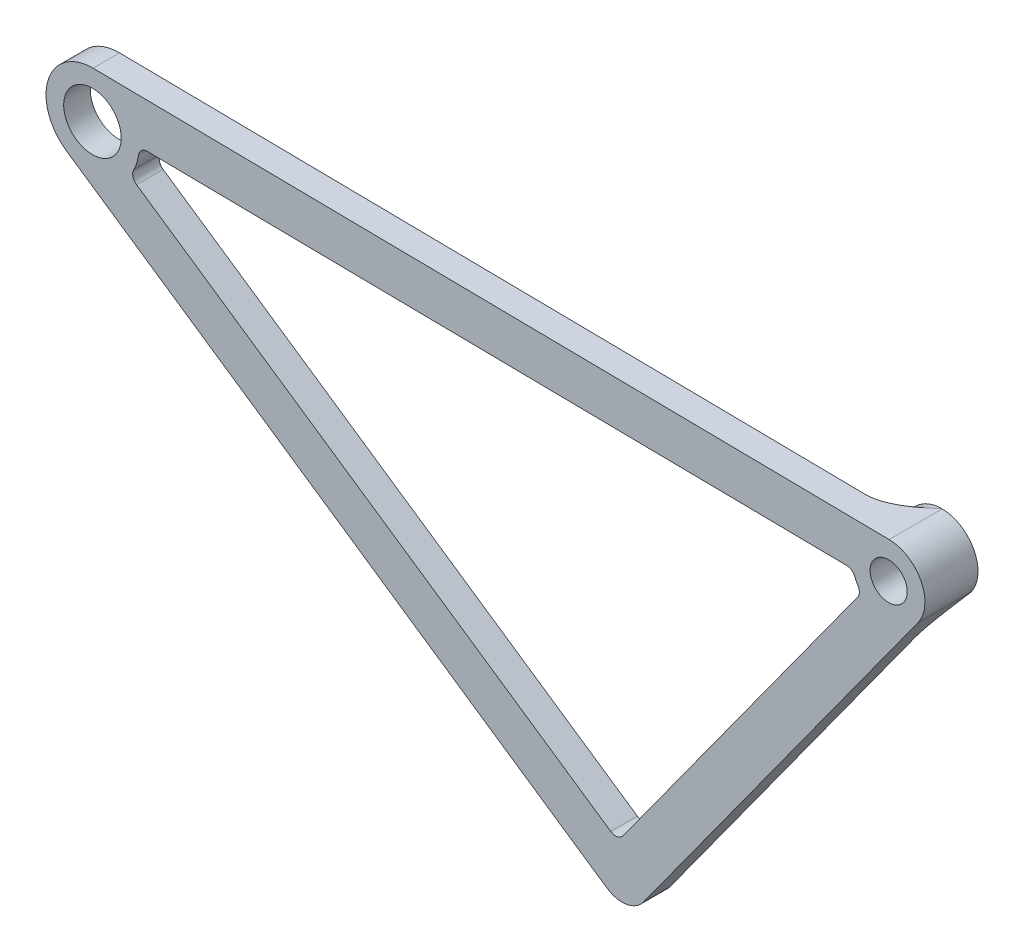
ISO-10303-21;
HEADER;
FILE_DESCRIPTION(('STEP AP214'),'2;1');
FILE_NAME('part.step','',(''),(''),'','','');
FILE_SCHEMA(('AUTOMOTIVE_DESIGN { 1 0 10303 214 1 1 1 1 }'));
ENDSEC;
DATA;
#1=APPLICATION_CONTEXT('core data for automotive mechanical design processes');
#2=APPLICATION_PROTOCOL_DEFINITION('international standard','automotive_design',2000,#1);
#3=PRODUCT_CONTEXT('',#1,'mechanical');
#4=PRODUCT('Part','Part','',(#3));
#5=PRODUCT_RELATED_PRODUCT_CATEGORY('part','',(#4));
#6=PRODUCT_DEFINITION_FORMATION('','',#4);
#7=PRODUCT_DEFINITION_CONTEXT('part definition',#1,'design');
#8=PRODUCT_DEFINITION('design','',#6,#7);
#9=PRODUCT_DEFINITION_SHAPE('','',#8);
#10=(LENGTH_UNIT() NAMED_UNIT(*) SI_UNIT(.MILLI.,.METRE.));
#11=(NAMED_UNIT(*) PLANE_ANGLE_UNIT() SI_UNIT($,.RADIAN.));
#12=(NAMED_UNIT(*) SI_UNIT($,.STERADIAN.) SOLID_ANGLE_UNIT());
#13=UNCERTAINTY_MEASURE_WITH_UNIT(LENGTH_MEASURE(1.E-05),#10,'distance_accuracy_value','');
#14=(GEOMETRIC_REPRESENTATION_CONTEXT(3) GLOBAL_UNCERTAINTY_ASSIGNED_CONTEXT((#13)) GLOBAL_UNIT_ASSIGNED_CONTEXT((#10,
#11,#12)) REPRESENTATION_CONTEXT('',''));
#15=CARTESIAN_POINT('',(0.,0.,0.));
#16=DIRECTION('',(0.,0.,1.));
#17=DIRECTION('',(1.,0.,0.));
#18=AXIS2_PLACEMENT_3D('',#15,#16,#17);
#19=CARTESIAN_POINT('',(90.,0.,1.5));
#20=DIRECTION('',(0.,0.,-1.));
#21=DIRECTION('',(-1.,0.,0.));
#22=AXIS2_PLACEMENT_3D('',#19,#20,#21);
#23=CYLINDRICAL_SURFACE('',#22,4.10000000000001);
#24=CARTESIAN_POINT('',(90.,0.,1.5));
#25=DIRECTION('',(0.,0.,-1.));
#26=DIRECTION('',(-1.,0.,0.));
#27=AXIS2_PLACEMENT_3D('',#24,#25,#26);
#28=CIRCLE('',#27,4.1);
#29=CARTESIAN_POINT('',(86.5314819350052,-2.18617987201531,1.5));
#30=VERTEX_POINT('',#29);
#31=CARTESIAN_POINT('',(86.1759418840921,-1.47870873607982,1.5));
#32=VERTEX_POINT('',#31);
#33=EDGE_CURVE('E379',#30,#32,#28,.T.);
#34=ORIENTED_EDGE('',*,*,#33,.T.);
#35=DIRECTION('',(0.,0.,-1.));
#36=VECTOR('',#35,1.);
#37=CARTESIAN_POINT('',(86.1759418840921,-1.47870873607983,1.5));
#38=LINE('',#37,#36);
#39=CARTESIAN_POINT('',(86.1759418840921,-1.47870873607982,-4.5));
#40=VERTEX_POINT('',#39);
#41=EDGE_CURVE('E395',#32,#40,#38,.T.);
#42=ORIENTED_EDGE('',*,*,#41,.T.);
#43=CARTESIAN_POINT('',(90.,0.,-4.5));
#44=DIRECTION('',(0.,0.,-1.));
#45=DIRECTION('',(-1.,0.,0.));
#46=AXIS2_PLACEMENT_3D('',#43,#44,#45);
#47=CIRCLE('',#46,4.1);
#48=CARTESIAN_POINT('',(86.5314819350052,-2.18617987201531,-4.5));
#49=VERTEX_POINT('',#48);
#50=EDGE_CURVE('E352',#49,#40,#47,.T.);
#51=ORIENTED_EDGE('',*,*,#50,.F.);
#52=DIRECTION('',(0.,0.,-1.));
#53=VECTOR('',#52,1.);
#54=CARTESIAN_POINT('',(86.5314819350052,-2.18617987201531,1.5));
#55=LINE('',#54,#53);
#56=EDGE_CURVE('E393',#49,#30,#55,.F.);
#57=ORIENTED_EDGE('',*,*,#56,.T.);
#58=EDGE_LOOP('',(#34,#42,#51,#57));
#59=FACE_BOUND('',#58,.T.);
#60=ADVANCED_FACE('F41',(#59),#23,.T.);
#61=CARTESIAN_POINT('',(0.,0.,1.5));
#62=DIRECTION('',(0.,0.,1.));
#63=DIRECTION('',(1.,0.,0.));
#64=AXIS2_PLACEMENT_3D('',#61,#62,#63);
#65=PLANE('',#64);
#66=CARTESIAN_POINT('',(0.,0.,1.5));
#67=DIRECTION('',(0.,0.,1.));
#68=DIRECTION('',(1.,0.,0.));
#69=AXIS2_PLACEMENT_3D('',#66,#67,#68);
#70=CIRCLE('',#69,3.25);
#71=CARTESIAN_POINT('',(3.25,0.,1.5));
#72=VERTEX_POINT('',#71);
#73=EDGE_CURVE('E453',#72,#72,#70,.T.);
#74=ORIENTED_EDGE('',*,*,#73,.F.);
#75=EDGE_LOOP('',(#74));
#76=FACE_BOUND('',#75,.T.);
#77=CARTESIAN_POINT('',(0.,0.,1.5));
#78=DIRECTION('',(0.,0.,1.));
#79=DIRECTION('',(1.,0.,0.));
#80=AXIS2_PLACEMENT_3D('',#77,#78,#79);
#81=CIRCLE('',#80,5.25);
#82=CARTESIAN_POINT('',(0.0670833333333359,5.24957139454154,1.5));
#83=VERTEX_POINT('',#82);
#84=CARTESIAN_POINT('',(-2.9553037466832,-4.33920266464246,1.5));
#85=VERTEX_POINT('',#84);
#86=EDGE_CURVE('E191',#83,#85,#81,.T.);
#87=ORIENTED_EDGE('',*,*,#86,.T.);
#88=DIRECTION('',(0.82651479326523,-0.56291499936823,0.));
#89=VECTOR('',#88,1.);
#90=CARTESIAN_POINT('',(-2.9553037466832,-4.33920266464246,1.5));
#91=LINE('',#90,#89);
#92=CARTESIAN_POINT('',(58.1785125856414,-45.9756530494388,1.5));
#93=VERTEX_POINT('',#92);
#94=EDGE_CURVE('E180',#85,#93,#91,.T.);
#95=ORIENTED_EDGE('',*,*,#94,.T.);
#96=CARTESIAN_POINT('',(59.8672575837461,-43.4961086696431,1.5));
#97=DIRECTION('',(0.,0.,1.));
#98=DIRECTION('',(1.,0.,0.));
#99=AXIS2_PLACEMENT_3D('',#96,#97,#98);
#100=CIRCLE('',#99,2.99999999999999);
#101=CARTESIAN_POINT('',(62.2972541343815,-45.2554030633986,1.5));
#102=VERTEX_POINT('',#101);
#103=EDGE_CURVE('E190',#93,#102,#100,.T.);
#104=ORIENTED_EDGE('',*,*,#103,.T.);
#105=DIRECTION('',(0.586431464585179,0.809998850211828,0.));
#106=VECTOR('',#105,1.);
#107=CARTESIAN_POINT('',(62.2972541343815,-45.2554030633986,1.5));
#108=LINE('',#107,#106);
#109=CARTESIAN_POINT('',(93.3209952858685,-2.40436900479924,1.5));
#110=VERTEX_POINT('',#109);
#111=EDGE_CURVE('E459',#102,#110,#108,.T.);
#112=ORIENTED_EDGE('',*,*,#111,.T.);
#113=CARTESIAN_POINT('',(90.,0.,1.5));
#114=DIRECTION('',(0.,0.,1.));
#115=DIRECTION('',(1.,0.,0.));
#116=AXIS2_PLACEMENT_3D('',#113,#114,#115);
#117=CIRCLE('',#116,4.10000000000001);
#118=CARTESIAN_POINT('',(90.0523888888889,4.09966527954674,1.5));
#119=VERTEX_POINT('',#118);
#120=EDGE_CURVE('E337',#110,#119,#117,.T.);
#121=ORIENTED_EDGE('',*,*,#120,.T.);
#122=DIRECTION('',(-0.999918360865057,0.0127777777777776,0.));
#123=VECTOR('',#122,1.);
#124=CARTESIAN_POINT('',(90.0523888888889,4.09966527954675,1.5));
#125=LINE('',#124,#123);
#126=EDGE_CURVE('E197',#119,#83,#125,.T.);
#127=ORIENTED_EDGE('',*,*,#126,.T.);
#128=EDGE_LOOP('',(#87,#95,#104,#112,#121,#127));
#129=FACE_BOUND('',#128,.T.);
#130=CARTESIAN_POINT('',(90.,0.,1.5));
#131=DIRECTION('',(0.,0.,1.));
#132=DIRECTION('',(1.,0.,0.));
#133=AXIS2_PLACEMENT_3D('',#130,#131,#132);
#134=CIRCLE('',#133,2.09999999999999);
#135=CARTESIAN_POINT('',(92.1,0.,1.5));
#136=VERTEX_POINT('',#135);
#137=EDGE_CURVE('E378',#136,#136,#134,.T.);
#138=ORIENTED_EDGE('',*,*,#137,.F.);
#139=EDGE_LOOP('',(#138));
#140=FACE_BOUND('',#139,.T.);
#141=DIRECTION('',(0.82651479326523,-0.56291499936823,0.));
#142=VECTOR('',#141,1.);
#143=CARTESIAN_POINT('',(59.3868925835546,-40.7491467492038,1.5));
#144=LINE('',#143,#142);
#145=CARTESIAN_POINT('',(4.98766067416049,-3.69942441461274,1.5));
#146=VERTEX_POINT('',#145);
#147=CARTESIAN_POINT('',(58.5837950840906,-40.2021805822494,1.5));
#148=VERTEX_POINT('',#147);
#149=EDGE_CURVE('E411',#146,#148,#144,.T.);
#150=ORIENTED_EDGE('',*,*,#149,.F.);
#151=CARTESIAN_POINT('',(5.55057567352873,-2.87290962134751,1.5));
#152=DIRECTION('',(0.,0.,1.));
#153=DIRECTION('',(1.,0.,0.));
#154=AXIS2_PLACEMENT_3D('',#151,#152,#153);
#155=CIRCLE('',#154,1.);
#156=CARTESIAN_POINT('',(4.66248356576413,-2.41324408193191,1.5));
#157=VERTEX_POINT('',#156);
#158=EDGE_CURVE('E400',#146,#157,#155,.F.);
#159=ORIENTED_EDGE('',*,*,#158,.T.);
#160=CARTESIAN_POINT('',(0.,0.,1.5));
#161=DIRECTION('',(0.,0.,-1.));
#162=DIRECTION('',(1.,0.,0.));
#163=AXIS2_PLACEMENT_3D('',#160,#161,#162);
#164=CIRCLE('',#163,5.25);
#165=CARTESIAN_POINT('',(5.20358742300718,-0.696547149245138,1.5));
#166=VERTEX_POINT('',#165);
#167=EDGE_CURVE('E421',#166,#157,#164,.T.);
#168=ORIENTED_EDGE('',*,*,#167,.F.);
#169=CARTESIAN_POINT('',(6.1947469321514,-0.829222796720403,1.5));
#170=DIRECTION('',(0.,0.,1.));
#171=DIRECTION('',(1.,0.,0.));
#172=AXIS2_PLACEMENT_3D('',#169,#170,#171);
#173=CIRCLE('',#172,1.);
#174=CARTESIAN_POINT('',(6.20752470992918,0.170695564144654,1.5));
#175=VERTEX_POINT('',#174);
#176=EDGE_CURVE('E382',#166,#175,#173,.F.);
#177=ORIENTED_EDGE('',*,*,#176,.T.);
#178=DIRECTION('',(-0.999918360865057,0.0127777777777778,0.));
#179=VECTOR('',#178,1.);
#180=CARTESIAN_POINT('',(85.9888265565398,-0.848815413667441,1.5));
#181=LINE('',#180,#179);
#182=CARTESIAN_POINT('',(85.2560225604289,-0.839451042551311,1.5));
#183=VERTEX_POINT('',#182);
#184=EDGE_CURVE('E370',#183,#175,#181,.T.);
#185=ORIENTED_EDGE('',*,*,#184,.F.);
#186=CARTESIAN_POINT('',(85.2432447826511,-1.83936940341637,1.5));
#187=DIRECTION('',(0.,0.,1.));
#188=DIRECTION('',(1.,0.,0.));
#189=AXIS2_PLACEMENT_3D('',#186,#187,#188);
#190=CIRCLE('',#189,1.);
#191=EDGE_CURVE('E66',#183,#32,#190,.F.);
#192=ORIENTED_EDGE('',*,*,#191,.T.);
#193=ORIENTED_EDGE('',*,*,#33,.F.);
#194=CARTESIAN_POINT('',(85.6855019191528,-2.71939447494588,1.5));
#195=DIRECTION('',(0.,0.,1.));
#196=DIRECTION('',(1.,0.,0.));
#197=AXIS2_PLACEMENT_3D('',#194,#195,#196);
#198=CIRCLE('',#197,1.);
#199=CARTESIAN_POINT('',(86.4955007693646,-3.30582593953106,1.5));
#200=VERTEX_POINT('',#199);
#201=EDGE_CURVE('E11',#30,#200,#198,.F.);
#202=ORIENTED_EDGE('',*,*,#201,.T.);
#203=DIRECTION('',(0.586431464585178,0.809998850211828,0.));
#204=VECTOR('',#203,1.);
#205=CARTESIAN_POINT('',(86.9252751764686,-2.71220708272065,1.5));
#206=LINE('',#205,#204);
#207=CARTESIAN_POINT('',(59.9567089336707,-39.9620972535694,1.5));
#208=VERTEX_POINT('',#207);
#209=EDGE_CURVE('E414',#208,#200,#206,.T.);
#210=ORIENTED_EDGE('',*,*,#209,.F.);
#211=CARTESIAN_POINT('',(59.1467100834588,-39.3756657889842,1.5));
#212=DIRECTION('',(0.,0.,1.));
#213=DIRECTION('',(1.,0.,0.));
#214=AXIS2_PLACEMENT_3D('',#211,#212,#213);
#215=CIRCLE('',#214,1.);
#216=EDGE_CURVE('E300',#208,#148,#215,.F.);
#217=ORIENTED_EDGE('',*,*,#216,.T.);
#218=EDGE_LOOP('',(#150,#159,#168,#177,#185,#192,#193,#202,#210,#217));
#219=FACE_BOUND('',#218,.T.);
#220=ADVANCED_FACE('F194',(#76,#129,#140,#219),#65,.T.);
#221=CARTESIAN_POINT('',(0.,0.,-1.5));
#222=DIRECTION('',(0.,0.,1.));
#223=DIRECTION('',(1.,0.,0.));
#224=AXIS2_PLACEMENT_3D('',#221,#222,#223);
#225=PLANE('',#224);
#226=DIRECTION('',(0.82651479326523,-0.56291499936823,0.));
#227=VECTOR('',#226,1.);
#228=CARTESIAN_POINT('',(59.3868925835546,-40.7491467492038,-1.5));
#229=LINE('',#228,#227);
#230=CARTESIAN_POINT('',(4.98766067416049,-3.69942441461274,-1.5));
#231=VERTEX_POINT('',#230);
#232=CARTESIAN_POINT('',(58.5837950840906,-40.2021805822494,-1.5));
#233=VERTEX_POINT('',#232);
#234=EDGE_CURVE('E445',#231,#233,#229,.T.);
#235=ORIENTED_EDGE('',*,*,#234,.T.);
#236=CARTESIAN_POINT('',(59.1467100834588,-39.3756657889842,-1.5));
#237=DIRECTION('',(0.,0.,1.));
#238=DIRECTION('',(1.,0.,0.));
#239=AXIS2_PLACEMENT_3D('',#236,#237,#238);
#240=CIRCLE('',#239,1.);
#241=CARTESIAN_POINT('',(59.9567089336707,-39.9620972535694,-1.5));
#242=VERTEX_POINT('',#241);
#243=EDGE_CURVE('E403',#233,#242,#240,.T.);
#244=ORIENTED_EDGE('',*,*,#243,.T.);
#245=DIRECTION('',(0.586431464585178,0.809998850211828,0.));
#246=VECTOR('',#245,1.);
#247=CARTESIAN_POINT('',(86.9252751764686,-2.71220708272065,-1.5));
#248=LINE('',#247,#246);
#249=CARTESIAN_POINT('',(85.1409244752631,-5.17681224740696,-1.5));
#250=VERTEX_POINT('',#249);
#251=EDGE_CURVE('E447',#242,#250,#248,.T.);
#252=ORIENTED_EDGE('',*,*,#251,.T.);
#253=CARTESIAN_POINT('',(90.,0.,-1.5));
#254=DIRECTION('',(0.,0.,1.));
#255=DIRECTION('',(1.,0.,0.));
#256=AXIS2_PLACEMENT_3D('',#253,#254,#255);
#257=CIRCLE('',#256,7.10000000000001);
#258=CARTESIAN_POINT('',(89.9217155702191,-7.09956840575918,-1.5));
#259=VERTEX_POINT('',#258);
#260=EDGE_CURVE('E208',#250,#259,#257,.T.);
#261=ORIENTED_EDGE('',*,*,#260,.T.);
#262=DIRECTION('',(0.586431464585179,0.809998850211828,0.));
#263=VECTOR('',#262,1.);
#264=CARTESIAN_POINT('',(62.2972541343815,-45.2554030633986,-1.5));
#265=LINE('',#264,#263);
#266=CARTESIAN_POINT('',(62.2972541343815,-45.2554030633986,-1.5));
#267=VERTEX_POINT('',#266);
#268=EDGE_CURVE('E345',#267,#259,#265,.T.);
#269=ORIENTED_EDGE('',*,*,#268,.F.);
#270=CARTESIAN_POINT('',(59.8672575837461,-43.4961086696431,-1.5));
#271=DIRECTION('',(0.,0.,1.));
#272=DIRECTION('',(1.,0.,0.));
#273=AXIS2_PLACEMENT_3D('',#270,#271,#272);
#274=CIRCLE('',#273,2.99999999999999);
#275=CARTESIAN_POINT('',(58.1785125856414,-45.9756530494388,-1.5));
#276=VERTEX_POINT('',#275);
#277=EDGE_CURVE('E467',#276,#267,#274,.T.);
#278=ORIENTED_EDGE('',*,*,#277,.F.);
#279=DIRECTION('',(0.82651479326523,-0.56291499936823,0.));
#280=VECTOR('',#279,1.);
#281=CARTESIAN_POINT('',(-2.9553037466832,-4.33920266464246,-1.5));
#282=LINE('',#281,#280);
#283=CARTESIAN_POINT('',(-2.9553037466832,-4.33920266464246,-1.5));
#284=VERTEX_POINT('',#283);
#285=EDGE_CURVE('E465',#284,#276,#282,.T.);
#286=ORIENTED_EDGE('',*,*,#285,.F.);
#287=CARTESIAN_POINT('',(0.,0.,-1.5));
#288=DIRECTION('',(0.,0.,1.));
#289=DIRECTION('',(1.,0.,0.));
#290=AXIS2_PLACEMENT_3D('',#287,#288,#289);
#291=CIRCLE('',#290,5.25);
#292=CARTESIAN_POINT('',(0.0670833333333359,5.24957139454154,-1.5));
#293=VERTEX_POINT('',#292);
#294=EDGE_CURVE('E205',#293,#284,#291,.T.);
#295=ORIENTED_EDGE('',*,*,#294,.F.);
#296=DIRECTION('',(-0.999918360865057,0.0127777777777776,0.));
#297=VECTOR('',#296,1.);
#298=CARTESIAN_POINT('',(90.0523888888889,4.09966527954675,-1.5));
#299=LINE('',#298,#297);
#300=CARTESIAN_POINT('',(84.2563114157978,4.17373231624949,-1.5));
#301=VERTEX_POINT('',#300);
#302=EDGE_CURVE('E201',#301,#293,#299,.T.);
#303=ORIENTED_EDGE('',*,*,#302,.F.);
#304=CARTESIAN_POINT('',(90.,0.,-1.5));
#305=DIRECTION('',(0.,0.,1.));
#306=DIRECTION('',(1.,0.,0.));
#307=AXIS2_PLACEMENT_3D('',#304,#305,#306);
#308=CIRCLE('',#307,7.10000000000001);
#309=CARTESIAN_POINT('',(82.9463482174555,-0.809936127485628,-1.5));
#310=VERTEX_POINT('',#309);
#311=EDGE_CURVE('E206',#301,#310,#308,.T.);
#312=ORIENTED_EDGE('',*,*,#311,.T.);
#313=DIRECTION('',(-0.999918360865057,0.0127777777777778,0.));
#314=VECTOR('',#313,1.);
#315=CARTESIAN_POINT('',(85.9888265565398,-0.848815413667441,-1.5));
#316=LINE('',#315,#314);
#317=CARTESIAN_POINT('',(6.20752470992918,0.170695564144654,-1.5));
#318=VERTEX_POINT('',#317);
#319=EDGE_CURVE('E432',#310,#318,#316,.T.);
#320=ORIENTED_EDGE('',*,*,#319,.T.);
#321=CARTESIAN_POINT('',(6.1947469321514,-0.829222796720403,-1.5));
#322=DIRECTION('',(0.,0.,1.));
#323=DIRECTION('',(1.,0.,0.));
#324=AXIS2_PLACEMENT_3D('',#321,#322,#323);
#325=CIRCLE('',#324,1.);
#326=CARTESIAN_POINT('',(5.20358742300718,-0.696547149245138,-1.5));
#327=VERTEX_POINT('',#326);
#328=EDGE_CURVE('E383',#318,#327,#325,.T.);
#329=ORIENTED_EDGE('',*,*,#328,.T.);
#330=CARTESIAN_POINT('',(0.,0.,-1.5));
#331=DIRECTION('',(0.,0.,-1.));
#332=DIRECTION('',(1.,0.,0.));
#333=AXIS2_PLACEMENT_3D('',#330,#331,#332);
#334=CIRCLE('',#333,5.25);
#335=CARTESIAN_POINT('',(4.66248356576413,-2.41324408193191,-1.5));
#336=VERTEX_POINT('',#335);
#337=EDGE_CURVE('E350',#327,#336,#334,.T.);
#338=ORIENTED_EDGE('',*,*,#337,.T.);
#339=CARTESIAN_POINT('',(5.55057567352873,-2.87290962134751,-1.5));
#340=DIRECTION('',(0.,0.,1.));
#341=DIRECTION('',(1.,0.,0.));
#342=AXIS2_PLACEMENT_3D('',#339,#340,#341);
#343=CIRCLE('',#342,1.);
#344=EDGE_CURVE('E398',#336,#231,#343,.T.);
#345=ORIENTED_EDGE('',*,*,#344,.T.);
#346=EDGE_LOOP('',(#235,#244,#252,#261,#269,#278,#286,#295,#303,#312,#320,#329,#338,#345));
#347=FACE_BOUND('',#346,.T.);
#348=CARTESIAN_POINT('',(0.,0.,-1.5));
#349=DIRECTION('',(0.,0.,1.));
#350=DIRECTION('',(1.,0.,0.));
#351=AXIS2_PLACEMENT_3D('',#348,#349,#350);
#352=CIRCLE('',#351,3.25);
#353=CARTESIAN_POINT('',(3.25,0.,-1.5));
#354=VERTEX_POINT('',#353);
#355=EDGE_CURVE('E452',#354,#354,#352,.T.);
#356=ORIENTED_EDGE('',*,*,#355,.T.);
#357=EDGE_LOOP('',(#356));
#358=FACE_BOUND('',#357,.T.);
#359=ADVANCED_FACE('F262',(#347,#358),#225,.F.);
#360=CARTESIAN_POINT('',(0.,0.,1.5));
#361=DIRECTION('',(0.,0.,-1.));
#362=DIRECTION('',(-1.,0.,0.));
#363=AXIS2_PLACEMENT_3D('',#360,#361,#362);
#364=CYLINDRICAL_SURFACE('',#363,5.25);
#365=ORIENTED_EDGE('',*,*,#294,.T.);
#366=DIRECTION('',(0.,0.,-1.));
#367=VECTOR('',#366,1.);
#368=CARTESIAN_POINT('',(-2.9553037466832,-4.33920266464246,1.5));
#369=LINE('',#368,#367);
#370=EDGE_CURVE('E184',#85,#284,#369,.T.);
#371=ORIENTED_EDGE('',*,*,#370,.F.);
#372=ORIENTED_EDGE('',*,*,#86,.F.);
#373=DIRECTION('',(0.,0.,-1.));
#374=VECTOR('',#373,1.);
#375=CARTESIAN_POINT('',(0.0670833333333359,5.24957139454154,1.5));
#376=LINE('',#375,#374);
#377=EDGE_CURVE('E463',#83,#293,#376,.T.);
#378=ORIENTED_EDGE('',*,*,#377,.T.);
#379=EDGE_LOOP('',(#365,#371,#372,#378));
#380=FACE_BOUND('',#379,.T.);
#381=ADVANCED_FACE('F203',(#380),#364,.T.);
#382=CARTESIAN_POINT('',(-2.9553037466832,-4.33920266464246,1.5));
#383=DIRECTION('',(0.56291499936823,0.82651479326523,0.));
#384=DIRECTION('',(-0.82651479326523,0.56291499936823,0.));
#385=AXIS2_PLACEMENT_3D('',#382,#383,#384);
#386=PLANE('',#385);
#387=ORIENTED_EDGE('',*,*,#285,.T.);
#388=DIRECTION('',(0.,0.,-1.));
#389=VECTOR('',#388,1.);
#390=CARTESIAN_POINT('',(58.1785125856414,-45.9756530494388,1.5));
#391=LINE('',#390,#389);
#392=EDGE_CURVE('E187',#93,#276,#391,.T.);
#393=ORIENTED_EDGE('',*,*,#392,.F.);
#394=ORIENTED_EDGE('',*,*,#94,.F.);
#395=ORIENTED_EDGE('',*,*,#370,.T.);
#396=EDGE_LOOP('',(#387,#393,#394,#395));
#397=FACE_BOUND('',#396,.T.);
#398=ADVANCED_FACE('F182',(#397),#386,.F.);
#399=CARTESIAN_POINT('',(59.8672575837461,-43.4961086696431,1.5));
#400=DIRECTION('',(0.,0.,-1.));
#401=DIRECTION('',(-1.,0.,0.));
#402=AXIS2_PLACEMENT_3D('',#399,#400,#401);
#403=CYLINDRICAL_SURFACE('',#402,2.99999999999999);
#404=ORIENTED_EDGE('',*,*,#277,.T.);
#405=DIRECTION('',(0.,0.,-1.));
#406=VECTOR('',#405,1.);
#407=CARTESIAN_POINT('',(62.2972541343815,-45.2554030633986,1.5));
#408=LINE('',#407,#406);
#409=EDGE_CURVE('E210',#102,#267,#408,.T.);
#410=ORIENTED_EDGE('',*,*,#409,.F.);
#411=ORIENTED_EDGE('',*,*,#103,.F.);
#412=ORIENTED_EDGE('',*,*,#392,.T.);
#413=EDGE_LOOP('',(#404,#410,#411,#412));
#414=FACE_BOUND('',#413,.T.);
#415=ADVANCED_FACE('F328',(#414),#403,.T.);
#416=CARTESIAN_POINT('',(62.2972541343815,-45.2554030633986,1.5));
#417=DIRECTION('',(-0.809998850211827,0.586431464585178,0.));
#418=DIRECTION('',(-0.586431464585179,-0.809998850211828,0.));
#419=AXIS2_PLACEMENT_3D('',#416,#417,#418);
#420=PLANE('',#419);
#421=ORIENTED_EDGE('',*,*,#268,.T.);
#422=CARTESIAN_POINT('',(89.9217155702191,-7.09956840575919,-1.5));
#423=CARTESIAN_POINT('',(89.9966366882899,-6.99608483920665,-1.49999294841604));
#424=CARTESIAN_POINT('',(90.0715197851079,-6.89265378888641,-1.50543769285002));
#425=CARTESIAN_POINT('',(90.2207231766776,-6.68656904937698,-1.5264361549453));
#426=CARTESIAN_POINT('',(90.2950439810742,-6.58391465624908,-1.54197922068621));
#427=CARTESIAN_POINT('',(90.4420389946992,-6.38088020258571,-1.58217611628578));
#428=CARTESIAN_POINT('',(90.514722272068,-6.28048761682973,-1.60673501398973));
#429=CARTESIAN_POINT('',(90.6589480026069,-6.08127819004676,-1.66420013503761));
#430=CARTESIAN_POINT('',(90.7304902125483,-5.98246168497552,-1.69710811344209));
#431=CARTESIAN_POINT('',(90.9173146536079,-5.72441348737957,-1.79385491692364));
#432=CARTESIAN_POINT('',(91.0314740744984,-5.56673265808175,-1.86405393823631));
#433=CARTESIAN_POINT('',(91.2556704534986,-5.25706508364435,-2.02145684501448));
#434=CARTESIAN_POINT('',(91.3657052705257,-5.1050812958402,-2.10866942038783));
#435=CARTESIAN_POINT('',(91.6906114634094,-4.65630994137571,-2.39221780608364));
#436=CARTESIAN_POINT('',(91.8990955093439,-4.36834476949686,-2.60978784015452));
#437=CARTESIAN_POINT('',(92.3142313228002,-3.79494523026977,-3.09404088743114));
#438=CARTESIAN_POINT('',(92.5199451379224,-3.51080639430273,-3.36295064544856));
#439=CARTESIAN_POINT('',(92.9222138444288,-2.95517933568852,-3.91846483691174));
#440=CARTESIAN_POINT('',(93.1187818262429,-2.68367303209962,-4.20504252388602));
#441=CARTESIAN_POINT('',(93.317190672918,-2.40962406408831,-4.49445039728547));
#442=CARTESIAN_POINT('',(93.3190929802966,-2.40699653319608,-4.49722520011656));
#443=CARTESIAN_POINT('',(93.3209952858685,-2.40436900479924,-4.5));
#444=B_SPLINE_CURVE_WITH_KNOTS('',3,(#422,#423,#424,#425,#426,#427,#428,#429,#430,#431,#432,
#433,#434,#435,#436,#437,#438,#439,#440,#441,#442,#443),.UNSPECIFIED.,.F.,.F.,(4,2,2,2,2,2,2,2,
2,2,4),(0.,0.383062403442888,0.765721399237968,1.14446163732036,1.52328155646242,
2.1430543945131,2.76314462285923,4.00966185663654,5.33448962406462,6.65735884377306,
6.67016509224793),.UNSPECIFIED.);
#445=CARTESIAN_POINT('',(93.3209952858685,-2.40436900479923,-4.5));
#446=VERTEX_POINT('',#445);
#447=EDGE_CURVE('E223',#259,#446,#444,.T.);
#448=ORIENTED_EDGE('',*,*,#447,.T.);
#449=DIRECTION('',(0.,0.,-1.));
#450=VECTOR('',#449,1.);
#451=CARTESIAN_POINT('',(93.3209952858685,-2.40436900479924,1.5));
#452=LINE('',#451,#450);
#453=EDGE_CURVE('E333',#110,#446,#452,.T.);
#454=ORIENTED_EDGE('',*,*,#453,.F.);
#455=ORIENTED_EDGE('',*,*,#111,.F.);
#456=ORIENTED_EDGE('',*,*,#409,.T.);
#457=EDGE_LOOP('',(#421,#448,#454,#455,#456));
#458=FACE_BOUND('',#457,.T.);
#459=ADVANCED_FACE('F323',(#458),#420,.F.);
#460=ORIENTED_EDGE('',*,*,#453,.T.);
#461=CARTESIAN_POINT('',(90.0523888888889,4.09966527954673,-4.5));
#462=VERTEX_POINT('',#461);
#463=EDGE_CURVE('E336',#462,#446,#47,.T.);
#464=ORIENTED_EDGE('',*,*,#463,.F.);
#465=DIRECTION('',(0.,0.,-1.));
#466=VECTOR('',#465,1.);
#467=CARTESIAN_POINT('',(90.0523888888889,4.09966527954674,1.5));
#468=LINE('',#467,#466);
#469=EDGE_CURVE('E339',#119,#462,#468,.T.);
#470=ORIENTED_EDGE('',*,*,#469,.F.);
#471=ORIENTED_EDGE('',*,*,#120,.F.);
#472=EDGE_LOOP('',(#460,#464,#470,#471));
#473=FACE_BOUND('',#472,.T.);
#474=ADVANCED_FACE('F270',(#473),#23,.T.);
#475=CARTESIAN_POINT('',(90.0523888888889,4.09966527954675,1.5));
#476=DIRECTION('',(-0.0127777777777776,-0.999918360865057,0.));
#477=DIRECTION('',(0.999918360865057,-0.0127777777777776,0.));
#478=AXIS2_PLACEMENT_3D('',#475,#476,#477);
#479=PLANE('',#478);
#480=ORIENTED_EDGE('',*,*,#469,.T.);
#481=CARTESIAN_POINT('',(84.2563114157978,4.17373231624949,-1.5));
#482=CARTESIAN_POINT('',(84.384058656694,4.17209985712104,-1.49999294841604));
#483=CARTESIAN_POINT('',(84.5117410679366,4.17046822643914,-1.50543769285002));
#484=CARTESIAN_POINT('',(84.766146262309,4.16721722799123,-1.5264361549453));
#485=CARTESIAN_POINT('',(84.8928699144293,4.16559784912056,-1.54197922068622));
#486=CARTESIAN_POINT('',(85.1435096258969,4.16239496910479,-1.58217611628579));
#487=CARTESIAN_POINT('',(85.2674411472391,4.16081127037362,-1.60673501398974));
#488=CARTESIAN_POINT('',(85.513358982117,4.15766873037371,-1.66420013503761));
#489=CARTESIAN_POINT('',(85.6353448809258,4.15610989440469,-1.69710811344209));
#490=CARTESIAN_POINT('',(85.9538973463977,4.15203916945987,-1.79385491692364));
#491=CARTESIAN_POINT('',(86.1485494206939,4.14955174543938,-1.86405393823632));
#492=CARTESIAN_POINT('',(86.5308243996813,4.14466672189878,-2.02145684501449));
#493=CARTESIAN_POINT('',(86.7184436536338,4.1422691690308,-2.10866942038784));
#494=CARTESIAN_POINT('',(87.2724379179985,4.13518977547502,-2.39221780608364));
#495=CARTESIAN_POINT('',(87.6279219567426,4.130647108565,-2.60978784015451));
#496=CARTESIAN_POINT('',(88.3357658348354,4.1216016983299,-3.09404088743117));
#497=CARTESIAN_POINT('',(88.6865263810312,4.11711939208579,-3.36295064544863));
#498=CARTESIAN_POINT('',(89.3724306851627,4.10835434373983,-3.91846483691169));
#499=CARTESIAN_POINT('',(89.7075967634582,4.10407131641011,-4.2050425238858));
#500=CARTESIAN_POINT('',(90.0459016818155,4.09974817840492,-4.49445039728546));
#501=CARTESIAN_POINT('',(90.0491452868924,4.09970672895615,-4.49722520011655));
#502=CARTESIAN_POINT('',(90.0523888888889,4.09966527954674,-4.5));
#503=B_SPLINE_CURVE_WITH_KNOTS('',3,(#481,#482,#483,#484,#485,#486,#487,#488,#489,#490,#491,
#492,#493,#494,#495,#496,#497,#498,#499,#500,#501,#502),.UNSPECIFIED.,.F.,.F.,(4,2,2,2,2,2,2,2,
2,2,4),(0.,0.383062403442891,0.765721399237984,1.14446163732037,1.52328155646243,
2.1430543945131,2.76314462285923,4.00966185663656,5.33448962406462,6.65735884377305,
6.67016509224794),.UNSPECIFIED.);
#504=EDGE_CURVE('E272',#462,#301,#503,.F.);
#505=ORIENTED_EDGE('',*,*,#504,.T.);
#506=ORIENTED_EDGE('',*,*,#302,.T.);
#507=ORIENTED_EDGE('',*,*,#377,.F.);
#508=ORIENTED_EDGE('',*,*,#126,.F.);
#509=EDGE_LOOP('',(#480,#505,#506,#507,#508));
#510=FACE_BOUND('',#509,.T.);
#511=ADVANCED_FACE('F258',(#510),#479,.F.);
#512=CARTESIAN_POINT('',(0.,0.,1.5));
#513=DIRECTION('',(0.,0.,-1.));
#514=DIRECTION('',(-1.,0.,0.));
#515=AXIS2_PLACEMENT_3D('',#512,#513,#514);
#516=CYLINDRICAL_SURFACE('',#515,3.25);
#517=ORIENTED_EDGE('',*,*,#73,.T.);
#518=EDGE_LOOP('',(#517));
#519=FACE_BOUND('',#518,.T.);
#520=ORIENTED_EDGE('',*,*,#355,.F.);
#521=EDGE_LOOP('',(#520));
#522=FACE_BOUND('',#521,.T.);
#523=ADVANCED_FACE('F254',(#519,#522),#516,.F.);
#524=CARTESIAN_POINT('',(90.,0.,1.5));
#525=DIRECTION('',(0.,0.,-1.));
#526=DIRECTION('',(-1.,0.,0.));
#527=AXIS2_PLACEMENT_3D('',#524,#525,#526);
#528=CYLINDRICAL_SURFACE('',#527,2.09999999999999);
#529=ORIENTED_EDGE('',*,*,#137,.T.);
#530=EDGE_LOOP('',(#529));
#531=FACE_BOUND('',#530,.T.);
#532=CARTESIAN_POINT('',(90.,0.,-4.5));
#533=DIRECTION('',(0.,0.,-1.));
#534=DIRECTION('',(-1.,0.,0.));
#535=AXIS2_PLACEMENT_3D('',#532,#533,#534);
#536=CIRCLE('',#535,2.09999999999999);
#537=CARTESIAN_POINT('',(87.9,0.,-4.5));
#538=VERTEX_POINT('',#537);
#539=EDGE_CURVE('E356',#538,#538,#536,.T.);
#540=ORIENTED_EDGE('',*,*,#539,.T.);
#541=EDGE_LOOP('',(#540));
#542=FACE_BOUND('',#541,.T.);
#543=ADVANCED_FACE('F250',(#531,#542),#528,.F.);
#544=CARTESIAN_POINT('',(0.,0.,1.5));
#545=DIRECTION('',(0.,0.,-1.));
#546=DIRECTION('',(-1.,0.,0.));
#547=AXIS2_PLACEMENT_3D('',#544,#545,#546);
#548=CYLINDRICAL_SURFACE('',#547,5.25);
#549=ORIENTED_EDGE('',*,*,#167,.T.);
#550=DIRECTION('',(0.,0.,-1.));
#551=VECTOR('',#550,1.);
#552=CARTESIAN_POINT('',(4.66248356576413,-2.41324408193191,1.5));
#553=LINE('',#552,#551);
#554=EDGE_CURVE('E423',#157,#336,#553,.T.);
#555=ORIENTED_EDGE('',*,*,#554,.T.);
#556=ORIENTED_EDGE('',*,*,#337,.F.);
#557=DIRECTION('',(0.,0.,-1.));
#558=VECTOR('',#557,1.);
#559=CARTESIAN_POINT('',(5.20358742300718,-0.696547149245138,1.5));
#560=LINE('',#559,#558);
#561=EDGE_CURVE('E426',#327,#166,#560,.F.);
#562=ORIENTED_EDGE('',*,*,#561,.T.);
#563=EDGE_LOOP('',(#549,#555,#556,#562));
#564=FACE_BOUND('',#563,.T.);
#565=ADVANCED_FACE('F246',(#564),#548,.T.);
#566=CARTESIAN_POINT('',(59.3868925835546,-40.7491467492038,1.5));
#567=DIRECTION('',(0.56291499936823,0.82651479326523,0.));
#568=DIRECTION('',(-0.82651479326523,0.56291499936823,0.));
#569=AXIS2_PLACEMENT_3D('',#566,#567,#568);
#570=PLANE('',#569);
#571=ORIENTED_EDGE('',*,*,#234,.F.);
#572=DIRECTION('',(0.,0.,1.));
#573=VECTOR('',#572,1.);
#574=CARTESIAN_POINT('',(4.9876606741605,-3.69942441461274,1.5));
#575=LINE('',#574,#573);
#576=EDGE_CURVE('E388',#231,#146,#575,.T.);
#577=ORIENTED_EDGE('',*,*,#576,.T.);
#578=ORIENTED_EDGE('',*,*,#149,.T.);
#579=DIRECTION('',(0.,0.,-1.));
#580=VECTOR('',#579,1.);
#581=CARTESIAN_POINT('',(58.5837950840906,-40.2021805822494,-1.5));
#582=LINE('',#581,#580);
#583=EDGE_CURVE('E419',#148,#233,#582,.T.);
#584=ORIENTED_EDGE('',*,*,#583,.T.);
#585=EDGE_LOOP('',(#571,#577,#578,#584));
#586=FACE_BOUND('',#585,.T.);
#587=ADVANCED_FACE('F240',(#586),#570,.T.);
#588=CARTESIAN_POINT('',(86.9252751764686,-2.71220708272065,1.5));
#589=DIRECTION('',(-0.809998850211827,0.586431464585178,0.));
#590=DIRECTION('',(-0.586431464585178,-0.809998850211828,0.));
#591=AXIS2_PLACEMENT_3D('',#588,#589,#590);
#592=PLANE('',#591);
#593=ORIENTED_EDGE('',*,*,#251,.F.);
#594=DIRECTION('',(0.,0.,-1.));
#595=VECTOR('',#594,1.);
#596=CARTESIAN_POINT('',(59.9567089336707,-39.9620972535694,1.5));
#597=LINE('',#596,#595);
#598=EDGE_CURVE('E386',#242,#208,#597,.F.);
#599=ORIENTED_EDGE('',*,*,#598,.T.);
#600=ORIENTED_EDGE('',*,*,#209,.T.);
#601=DIRECTION('',(0.,0.,-1.));
#602=VECTOR('',#601,1.);
#603=CARTESIAN_POINT('',(86.4955007693646,-3.30582593953106,1.5));
#604=LINE('',#603,#602);
#605=CARTESIAN_POINT('',(86.4955007693646,-3.30582593953107,-2.55295192865383));
#606=VERTEX_POINT('',#605);
#607=EDGE_CURVE('E384',#200,#606,#604,.T.);
#608=ORIENTED_EDGE('',*,*,#607,.T.);
#609=CARTESIAN_POINT('',(86.9252751764686,-2.71220708272066,-4.5));
#610=CARTESIAN_POINT('',(86.9252812615506,-2.71219867780093,-4.41683052112646));
#611=CARTESIAN_POINT('',(86.9231963278829,-2.71507845826223,-4.33366608103657));
#612=CARTESIAN_POINT('',(86.914891351072,-2.72654957138309,-4.16795001340954));
#613=CARTESIAN_POINT('',(86.9086718338514,-2.73514017762063,-4.0853983092821));
#614=CARTESIAN_POINT('',(86.8921579630902,-2.75794969098563,-3.92162156301453));
#615=CARTESIAN_POINT('',(86.8818702172901,-2.77215947127976,-3.84039459087034));
#616=CARTESIAN_POINT('',(86.8573202785337,-2.80606867187067,-3.67972947820321));
#617=CARTESIAN_POINT('',(86.8430580663237,-2.82576811876134,-3.60029134634805));
#618=CARTESIAN_POINT('',(86.7944690626421,-2.89288088383591,-3.36547990058257));
#619=CARTESIAN_POINT('',(86.7543263662973,-2.94832732531681,-3.21347665496682));
#620=CARTESIAN_POINT('',(86.6598725855181,-3.07879006214054,-2.92296712283594));
#621=CARTESIAN_POINT('',(86.6055597322244,-3.15380880069114,-2.78446252432244));
#622=CARTESIAN_POINT('',(86.4835188605773,-3.32237575468798,-2.52263312944131));
#623=CARTESIAN_POINT('',(86.4156131030665,-3.4161694694325,-2.39954891448538));
#624=CARTESIAN_POINT('',(86.268830789079,-3.61891013520728,-2.17412139404517));
#625=CARTESIAN_POINT('',(86.1899518058573,-3.72786043813936,-2.07178268879603));
#626=CARTESIAN_POINT('',(86.0218896721068,-3.95999350623522,-1.88890019593663));
#627=CARTESIAN_POINT('',(85.9325440393286,-4.08340069734306,-1.80879067070087));
#628=CARTESIAN_POINT('',(85.7472790679949,-4.33929490293628,-1.67516720559396));
#629=CARTESIAN_POINT('',(85.6513630890297,-4.47177727704229,-1.62163978741175));
#630=CARTESIAN_POINT('',(85.4859663144909,-4.70022886140596,-1.55489630238778));
#631=CARTESIAN_POINT('',(85.4174734055147,-4.79483356949001,-1.53433527494176));
#632=CARTESIAN_POINT('',(85.2796383838195,-4.98521593441134,-1.50688592563036));
#633=CARTESIAN_POINT('',(85.2102974269258,-5.08099199478395,-1.49998071467556));
#634=CARTESIAN_POINT('',(85.1409244752631,-5.17681224740696,-1.5));
#635=B_SPLINE_CURVE_WITH_KNOTS('',3,(#609,#610,#611,#612,#613,#614,#615,#616,#617,#618,#619,
#620,#621,#622,#623,#624,#625,#626,#627,#628,#629,#630,#631,#632,#633,#634),.UNSPECIFIED.,.F.,
.F.,(4,2,2,2,2,2,2,2,2,2,2,2,4),(0.,0.249423683355804,0.498815645870777,0.747804191269518,
0.996793942877591,1.49437392081679,1.99201604135507,2.49664909530186,3.00139392753027,
3.51539817810731,4.02914153887732,4.38416629060566,4.73875168347318),.UNSPECIFIED.);
#636=EDGE_CURVE('E215',#606,#250,#635,.T.);
#637=ORIENTED_EDGE('',*,*,#636,.T.);
#638=EDGE_LOOP('',(#593,#599,#600,#608,#637));
#639=FACE_BOUND('',#638,.T.);
#640=ADVANCED_FACE('F234',(#639),#592,.T.);
#641=CARTESIAN_POINT('',(85.9888265565398,-0.848815413667441,1.5));
#642=DIRECTION('',(-0.0127777777777778,-0.999918360865057,0.));
#643=DIRECTION('',(0.999918360865057,-0.0127777777777778,0.));
#644=AXIS2_PLACEMENT_3D('',#641,#642,#643);
#645=PLANE('',#644);
#646=ORIENTED_EDGE('',*,*,#184,.T.);
#647=DIRECTION('',(0.,0.,1.));
#648=VECTOR('',#647,1.);
#649=CARTESIAN_POINT('',(6.20752470992918,0.170695564144655,-1.5));
#650=LINE('',#649,#648);
#651=EDGE_CURVE('E373',#175,#318,#650,.F.);
#652=ORIENTED_EDGE('',*,*,#651,.T.);
#653=ORIENTED_EDGE('',*,*,#319,.F.);
#654=CARTESIAN_POINT('',(82.9463482174555,-0.809936127485628,-1.5));
#655=CARTESIAN_POINT('',(83.0324461993423,-0.811036358187176,-1.4999919298512));
#656=CARTESIAN_POINT('',(83.1185391744038,-0.812136524907399,-1.50364742599899));
#657=CARTESIAN_POINT('',(83.2901036920343,-0.814328917173241,-1.5182095657547));
#658=CARTESIAN_POINT('',(83.3755752801785,-0.815421143301258,-1.52911567203391));
#659=CARTESIAN_POINT('',(83.5452293093598,-0.817589121777128,-1.55809124336785));
#660=CARTESIAN_POINT('',(83.6294127452623,-0.818664886838189,-1.5761548569011));
#661=CARTESIAN_POINT('',(83.7959401227249,-0.820792910391325,-1.61929038245575));
#662=CARTESIAN_POINT('',(83.878284071615,-0.821845168977068,-1.64436226654516));
#663=CARTESIAN_POINT('',(84.1217451112014,-0.82495631402964,-1.72986959668255));
#664=CARTESIAN_POINT('',(84.2793821256044,-0.826970729224348,-1.80061231713701));
#665=CARTESIAN_POINT('',(84.5804734866106,-0.830818321840226,-1.96746976726909));
#666=CARTESIAN_POINT('',(84.7239293010767,-0.832651518018954,-2.06358186723368));
#667=CARTESIAN_POINT('',(84.9928982558227,-0.836088624154192,-2.27871973131016));
#668=CARTESIAN_POINT('',(85.1183831133577,-0.837692172690566,-2.39778093681913));
#669=CARTESIAN_POINT('',(85.3474086265842,-0.840618848735316,-2.65547158321684));
#670=CARTESIAN_POINT('',(85.4509452249468,-0.841941924395813,-2.79410463425617));
#671=CARTESIAN_POINT('',(85.6320269116143,-0.844255934861488,-3.08580638722284));
#672=CARTESIAN_POINT('',(85.7097821725319,-0.845249555424869,-3.23874463541953));
#673=CARTESIAN_POINT('',(85.8378345834253,-0.846885914266094,-3.55564802431854));
#674=CARTESIAN_POINT('',(85.8881573921379,-0.847528980432343,-3.71960269906384));
#675=CARTESIAN_POINT('',(85.9454553472147,-0.848261180745635,-3.98736396517922));
#676=CARTESIAN_POINT('',(85.9617050282821,-0.848468832511785,-4.08927284494386));
#677=CARTESIAN_POINT('',(85.9833902504765,-0.848745944085195,-4.29410416410424));
#678=CARTESIAN_POINT('',(85.9888394043805,-0.848815577847698,-4.39702516311965));
#679=CARTESIAN_POINT('',(85.9888265565398,-0.848815413667441,-4.5));
#680=B_SPLINE_CURVE_WITH_KNOTS('',3,(#654,#655,#656,#657,#658,#659,#660,#661,#662,#663,#664,
#665,#666,#667,#668,#669,#670,#671,#672,#673,#674,#675,#676,#677,#678,#679),.UNSPECIFIED.,.F.,
.F.,(4,2,2,2,2,2,2,2,2,2,2,2,4),(0.,0.258228824168262,0.516438513630039,0.774437541422808,
1.03243554095645,1.54815880336285,2.06382862843714,2.58030130175723,3.09686936650039,
3.60911637300935,4.12088342745036,4.42994935412777,4.73862549170783),.UNSPECIFIED.);
#681=CARTESIAN_POINT('',(85.2560225604289,-0.839451042551311,-2.55295192865385));
#682=VERTEX_POINT('',#681);
#683=EDGE_CURVE('E278',#310,#682,#680,.T.);
#684=ORIENTED_EDGE('',*,*,#683,.T.);
#685=DIRECTION('',(0.,0.,-1.));
#686=VECTOR('',#685,1.);
#687=CARTESIAN_POINT('',(85.2560225604289,-0.839451042551311,1.5));
#688=LINE('',#687,#686);
#689=EDGE_CURVE('E377',#682,#183,#688,.F.);
#690=ORIENTED_EDGE('',*,*,#689,.T.);
#691=EDGE_LOOP('',(#646,#652,#653,#684,#690));
#692=FACE_BOUND('',#691,.T.);
#693=ADVANCED_FACE('F239',(#692),#645,.T.);
#694=CARTESIAN_POINT('',(90.,0.,-4.5));
#695=DIRECTION('',(0.,0.,-1.));
#696=DIRECTION('',(-1.,0.,0.));
#697=AXIS2_PLACEMENT_3D('',#694,#695,#696);
#698=PLANE('',#697);
#699=ORIENTED_EDGE('',*,*,#463,.T.);
#700=EDGE_CURVE('E57',#446,#49,#47,.T.);
#701=ORIENTED_EDGE('',*,*,#700,.T.);
#702=ORIENTED_EDGE('',*,*,#50,.T.);
#703=EDGE_CURVE('E78',#40,#462,#47,.T.);
#704=ORIENTED_EDGE('',*,*,#703,.T.);
#705=EDGE_LOOP('',(#699,#701,#702,#704));
#706=FACE_BOUND('',#705,.T.);
#707=ORIENTED_EDGE('',*,*,#539,.F.);
#708=EDGE_LOOP('',(#707));
#709=FACE_BOUND('',#708,.T.);
#710=ADVANCED_FACE('F348',(#706,#709),#698,.T.);
#711=CARTESIAN_POINT('',(90.,0.,-4.5));
#712=DIRECTION('',(0.,0.,1.));
#713=DIRECTION('',(1.,0.,0.));
#714=AXIS2_PLACEMENT_3D('',#711,#712,#713);
#715=TOROIDAL_SURFACE('',#714,7.10000000000001,3.);
#716=ORIENTED_EDGE('',*,*,#447,.F.);
#717=ORIENTED_EDGE('',*,*,#260,.F.);
#718=ORIENTED_EDGE('',*,*,#636,.F.);
#719=CARTESIAN_POINT('',(86.4955007693646,-3.30582593953106,-2.55295192865383));
#720=CARTESIAN_POINT('',(86.5206793452993,-3.27100199381831,-2.60241824423345));
#721=CARTESIAN_POINT('',(86.5428585756066,-3.2356951535611,-2.65297653531357));
#722=CARTESIAN_POINT('',(86.58176430862,-3.16476951982399,-2.75578366581223));
#723=CARTESIAN_POINT('',(86.5985019028993,-3.12915151479511,-2.80802882476745));
#724=CARTESIAN_POINT('',(86.6270845890276,-3.0583184501725,-2.91361133993595));
#725=CARTESIAN_POINT('',(86.6389578471823,-3.02310225265392,-2.96694047601169));
#726=CARTESIAN_POINT('',(86.6584667158246,-2.95318385475791,-3.0747380817481));
#727=CARTESIAN_POINT('',(86.666099383899,-2.91848202749583,-3.12920731536097));
#728=CARTESIAN_POINT('',(86.6811867044419,-2.82819425985822,-3.27371065568985));
#729=CARTESIAN_POINT('',(86.6854861040887,-2.77325645489322,-3.36448549947725));
#730=CARTESIAN_POINT('',(86.6855176476354,-2.66612093295983,-3.54763544068582));
#731=CARTESIAN_POINT('',(86.6812457211099,-2.6139245299315,-3.64001127774795));
#732=CARTESIAN_POINT('',(86.6652180973052,-2.51252185632221,-3.82600955065803));
#733=CARTESIAN_POINT('',(86.6534451661009,-2.46332275814397,-3.91963436983905));
#734=CARTESIAN_POINT('',(86.6231723384302,-2.3683117176115,-4.10744897791738));
#735=CARTESIAN_POINT('',(86.6046754558877,-2.32249826873753,-4.20163849512148));
#736=CARTESIAN_POINT('',(86.5682123735087,-2.24827467750136,-4.36068463904527));
#737=CARTESIAN_POINT('',(86.5518976557411,-2.21891118177014,-4.4254801415156));
#738=CARTESIAN_POINT('',(86.5332685160317,-2.18902233356085,-4.49351449984471));
#739=CARTESIAN_POINT('',(86.5323770092804,-2.18759997339926,-4.49675725848341));
#740=CARTESIAN_POINT('',(86.5314819350052,-2.18617987201532,-4.5));
#741=B_SPLINE_CURVE_WITH_KNOTS('',3,(#719,#720,#721,#722,#723,#724,#725,#726,#727,#728,#729,
#730,#731,#732,#733,#734,#735,#736,#737,#738,#739,#740),.UNSPECIFIED.,.F.,.F.,(4,2,2,2,2,2,2,2,
2,2,4),(0.,0.196393766837103,0.392384681412946,0.587224125892175,0.782198595073519,
1.10027932485577,1.41851114331538,1.73747676453817,2.05629958949752,2.27517330656014,
2.28612776504954),.UNSPECIFIED.);
#742=EDGE_CURVE('E50',#606,#49,#741,.T.);
#743=ORIENTED_EDGE('',*,*,#742,.T.);
#744=ORIENTED_EDGE('',*,*,#700,.F.);
#745=EDGE_LOOP('',(#716,#717,#718,#743,#744));
#746=FACE_BOUND('',#745,.T.);
#747=ADVANCED_FACE('F230',(#746),#715,.F.);
#748=CARTESIAN_POINT('',(90.,0.,-4.5));
#749=DIRECTION('',(0.,0.,1.));
#750=DIRECTION('',(1.,0.,0.));
#751=AXIS2_PLACEMENT_3D('',#748,#749,#750);
#752=TOROIDAL_SURFACE('',#751,7.10000000000001,3.);
#753=ORIENTED_EDGE('',*,*,#683,.F.);
#754=ORIENTED_EDGE('',*,*,#311,.F.);
#755=ORIENTED_EDGE('',*,*,#504,.F.);
#756=ORIENTED_EDGE('',*,*,#703,.F.);
#757=CARTESIAN_POINT('',(85.2560225604289,-0.839451042551311,-2.55295192865385));
#758=CARTESIAN_POINT('',(85.2989915692443,-0.840027377978717,-2.60241824423345));
#759=CARTESIAN_POINT('',(85.3405582614472,-0.843298665994181,-2.65297653531356));
#760=CARTESIAN_POINT('',(85.4206881437895,-0.854402878624022,-2.75578366581218));
#761=CARTESIAN_POINT('',(85.4592573199588,-0.86222643242752,-2.8080288247674));
#762=CARTESIAN_POINT('',(85.5331528125297,-0.88155902583435,-2.91361133993589));
#763=CARTESIAN_POINT('',(85.5684968498274,-0.893046142721347,-2.96694047601163));
#764=CARTESIAN_POINT('',(85.6362437262107,-0.91911411272988,-3.07473808174807));
#765=CARTESIAN_POINT('',(85.668644510057,-0.933697104309227,-3.12920731536096));
#766=CARTESIAN_POINT('',(85.7500980857186,-0.975468185670544,-3.27371065568985));
#767=CARTESIAN_POINT('',(85.7967479428298,-1.00480141057342,-3.36448549947725));
#768=CARTESIAN_POINT('',(85.8827365332551,-1.06870746170792,-3.54763544068584));
#769=CARTESIAN_POINT('',(85.9220717832523,-1.1032827701373,-3.64001127774801));
#770=CARTESIAN_POINT('',(85.9938770657953,-1.17665434732411,-3.82600955065802));
#771=CARTESIAN_POINT('',(86.0263310588606,-1.21546016524907,-3.91963436983894));
#772=CARTESIAN_POINT('',(86.0845068515725,-1.29644855367904,-4.10744897791751));
#773=CARTESIAN_POINT('',(86.1102316586196,-1.33862960468355,-4.20163849512195));
#774=CARTESIAN_POINT('',(86.1480328495162,-1.41218072866977,-4.36068463904491));
#775=CARTESIAN_POINT('',(86.1618597364986,-1.44279448528123,-4.4254801415145));
#776=CARTESIAN_POINT('',(86.1747270937464,-1.47557892077907,-4.4935144998446));
#777=CARTESIAN_POINT('',(86.175336459616,-1.47714307101272,-4.49675725848336));
#778=CARTESIAN_POINT('',(86.1759418840921,-1.47870873607982,-4.5));
#779=B_SPLINE_CURVE_WITH_KNOTS('',3,(#757,#758,#759,#760,#761,#762,#763,#764,#765,#766,#767,
#768,#769,#770,#771,#772,#773,#774,#775,#776,#777,#778),.UNSPECIFIED.,.F.,.F.,(4,2,2,2,2,2,2,2,
2,2,4),(0.,0.196393766837053,0.392384681412848,0.58722412589211,0.782198595073512,
1.10027932485578,1.4185111433154,1.73747676453817,2.05629958949749,2.27517330656012,
2.28612776504953),.UNSPECIFIED.);
#780=EDGE_CURVE('E293',#40,#682,#779,.F.);
#781=ORIENTED_EDGE('',*,*,#780,.T.);
#782=EDGE_LOOP('',(#753,#754,#755,#756,#781));
#783=FACE_BOUND('',#782,.T.);
#784=ADVANCED_FACE('F284',(#783),#752,.F.);
#785=CARTESIAN_POINT('',(5.55057567352873,-2.87290962134751,1.5));
#786=DIRECTION('',(0.,0.,-1.));
#787=DIRECTION('',(-1.,0.,0.));
#788=AXIS2_PLACEMENT_3D('',#785,#786,#787);
#789=CYLINDRICAL_SURFACE('',#788,1.);
#790=ORIENTED_EDGE('',*,*,#158,.F.);
#791=ORIENTED_EDGE('',*,*,#576,.F.);
#792=ORIENTED_EDGE('',*,*,#344,.F.);
#793=ORIENTED_EDGE('',*,*,#554,.F.);
#794=EDGE_LOOP('',(#790,#791,#792,#793));
#795=FACE_BOUND('',#794,.T.);
#796=ADVANCED_FACE('F288',(#795),#789,.F.);
#797=CARTESIAN_POINT('',(6.1947469321514,-0.829222796720403,1.5));
#798=DIRECTION('',(0.,0.,-1.));
#799=DIRECTION('',(-1.,0.,0.));
#800=AXIS2_PLACEMENT_3D('',#797,#798,#799);
#801=CYLINDRICAL_SURFACE('',#800,1.);
#802=ORIENTED_EDGE('',*,*,#176,.F.);
#803=ORIENTED_EDGE('',*,*,#561,.F.);
#804=ORIENTED_EDGE('',*,*,#328,.F.);
#805=ORIENTED_EDGE('',*,*,#651,.F.);
#806=EDGE_LOOP('',(#802,#803,#804,#805));
#807=FACE_BOUND('',#806,.T.);
#808=ADVANCED_FACE('F309',(#807),#801,.F.);
#809=CARTESIAN_POINT('',(59.1467100834588,-39.3756657889842,1.5));
#810=DIRECTION('',(0.,0.,1.));
#811=DIRECTION('',(1.,0.,0.));
#812=AXIS2_PLACEMENT_3D('',#809,#810,#811);
#813=CYLINDRICAL_SURFACE('',#812,1.);
#814=ORIENTED_EDGE('',*,*,#216,.F.);
#815=ORIENTED_EDGE('',*,*,#598,.F.);
#816=ORIENTED_EDGE('',*,*,#243,.F.);
#817=ORIENTED_EDGE('',*,*,#583,.F.);
#818=EDGE_LOOP('',(#814,#815,#816,#817));
#819=FACE_BOUND('',#818,.T.);
#820=ADVANCED_FACE('F306',(#819),#813,.F.);
#821=CARTESIAN_POINT('',(85.2432447826511,-1.83936940341637,1.5));
#822=DIRECTION('',(0.,0.,-1.));
#823=DIRECTION('',(-1.,0.,0.));
#824=AXIS2_PLACEMENT_3D('',#821,#822,#823);
#825=CYLINDRICAL_SURFACE('',#824,1.);
#826=ORIENTED_EDGE('',*,*,#191,.F.);
#827=ORIENTED_EDGE('',*,*,#689,.F.);
#828=ORIENTED_EDGE('',*,*,#780,.F.);
#829=ORIENTED_EDGE('',*,*,#41,.F.);
#830=EDGE_LOOP('',(#826,#827,#828,#829));
#831=FACE_BOUND('',#830,.T.);
#832=ADVANCED_FACE('F302',(#831),#825,.F.);
#833=CARTESIAN_POINT('',(85.6855019191528,-2.71939447494588,1.5));
#834=DIRECTION('',(0.,0.,-1.));
#835=DIRECTION('',(-1.,0.,0.));
#836=AXIS2_PLACEMENT_3D('',#833,#834,#835);
#837=CYLINDRICAL_SURFACE('',#836,1.);
#838=ORIENTED_EDGE('',*,*,#201,.F.);
#839=ORIENTED_EDGE('',*,*,#56,.F.);
#840=ORIENTED_EDGE('',*,*,#742,.F.);
#841=ORIENTED_EDGE('',*,*,#607,.F.);
#842=EDGE_LOOP('',(#838,#839,#840,#841));
#843=FACE_BOUND('',#842,.T.);
#844=ADVANCED_FACE('F43',(#843),#837,.F.);
#845=CLOSED_SHELL('',(#60,#220,#359,#381,#398,#415,#459,#474,#511,#523,#543,#565,#587,#640,#693,
#710,#747,#784,#796,#808,#820,#832,#844));
#846=MANIFOLD_SOLID_BREP('B2',#845);
#847=ADVANCED_BREP_SHAPE_REPRESENTATION('',(#18,#846),#14);
#848=SHAPE_DEFINITION_REPRESENTATION(#9,#847);
ENDSEC;
END-ISO-10303-21;
